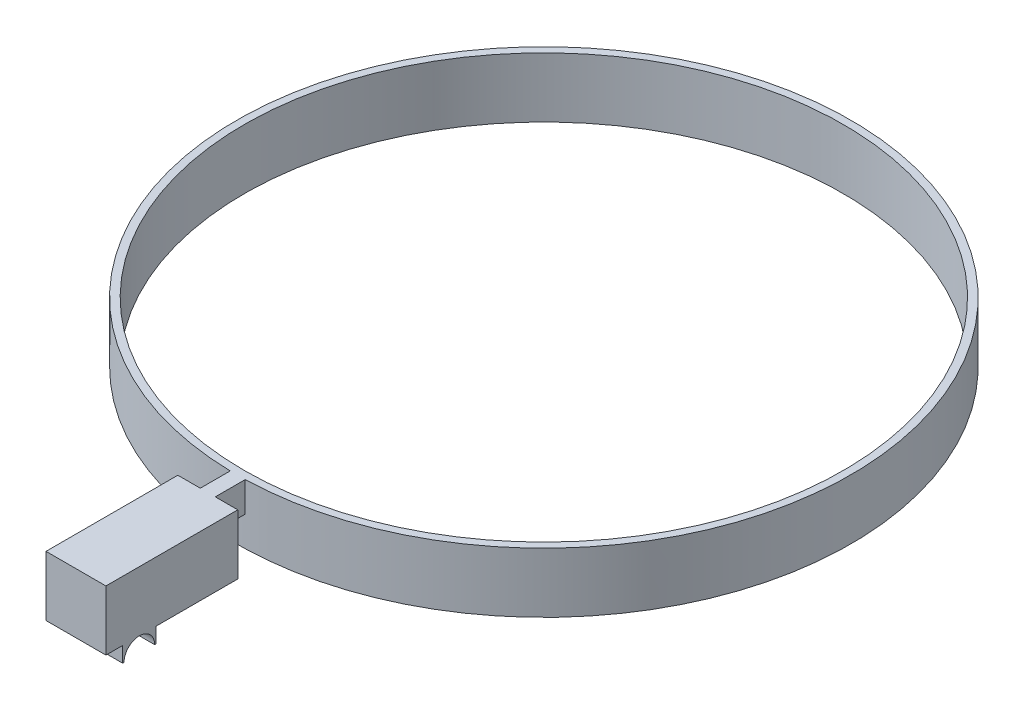
ISO-10303-21;
HEADER;
FILE_DESCRIPTION(('STEP AP214'),'2;1');
FILE_NAME('part.step','',(''),(''),'','','');
FILE_SCHEMA(('AUTOMOTIVE_DESIGN { 1 0 10303 214 1 1 1 1 }'));
ENDSEC;
DATA;
#1=APPLICATION_CONTEXT('core data for automotive mechanical design processes');
#2=APPLICATION_PROTOCOL_DEFINITION('international standard','automotive_design',2000,#1);
#3=PRODUCT_CONTEXT('',#1,'mechanical');
#4=PRODUCT('Part','Part','',(#3));
#5=PRODUCT_RELATED_PRODUCT_CATEGORY('part','',(#4));
#6=PRODUCT_DEFINITION_FORMATION('','',#4);
#7=PRODUCT_DEFINITION_CONTEXT('part definition',#1,'design');
#8=PRODUCT_DEFINITION('design','',#6,#7);
#9=PRODUCT_DEFINITION_SHAPE('','',#8);
#10=(LENGTH_UNIT() NAMED_UNIT(*) SI_UNIT(.MILLI.,.METRE.));
#11=(NAMED_UNIT(*) PLANE_ANGLE_UNIT() SI_UNIT($,.RADIAN.));
#12=(NAMED_UNIT(*) SI_UNIT($,.STERADIAN.) SOLID_ANGLE_UNIT());
#13=UNCERTAINTY_MEASURE_WITH_UNIT(LENGTH_MEASURE(1.E-05),#10,'distance_accuracy_value','');
#14=(GEOMETRIC_REPRESENTATION_CONTEXT(3) GLOBAL_UNCERTAINTY_ASSIGNED_CONTEXT((#13)) GLOBAL_UNIT_ASSIGNED_CONTEXT((#10,
#11,#12)) REPRESENTATION_CONTEXT('',''));
#15=CARTESIAN_POINT('',(0.,0.,0.));
#16=DIRECTION('',(0.,0.,1.));
#17=DIRECTION('',(1.,0.,0.));
#18=AXIS2_PLACEMENT_3D('',#15,#16,#17);
#19=CARTESIAN_POINT('',(-9.70143821147033,0.,156.461788252576));
#20=DIRECTION('',(0.,1.,0.));
#21=DIRECTION('',(0.,0.,1.));
#22=AXIS2_PLACEMENT_3D('',#19,#20,#21);
#23=PLANE('',#22);
#24=DIRECTION('',(0.,0.,-1.));
#25=VECTOR('',#24,1.);
#26=CARTESIAN_POINT('',(-9.70143821147033,0.,156.461788252576));
#27=LINE('',#26,#25);
#28=CARTESIAN_POINT('',(-9.70143821147033,0.,156.461788252576));
#29=VERTEX_POINT('',#28);
#30=CARTESIAN_POINT('',(-9.70143821147033,0.,150.911788252576));
#31=VERTEX_POINT('',#30);
#32=EDGE_CURVE('E155',#29,#31,#27,.T.);
#33=ORIENTED_EDGE('',*,*,#32,.T.);
#34=DIRECTION('',(-1.,0.,0.));
#35=VECTOR('',#34,1.);
#36=CARTESIAN_POINT('',(10.2985617885297,0.,150.911788252576));
#37=LINE('',#36,#35);
#38=CARTESIAN_POINT('',(10.2985617885297,0.,150.911788252576));
#39=VERTEX_POINT('',#38);
#40=EDGE_CURVE('E137',#39,#31,#37,.T.);
#41=ORIENTED_EDGE('',*,*,#40,.F.);
#42=DIRECTION('',(0.,0.,-1.));
#43=VECTOR('',#42,1.);
#44=CARTESIAN_POINT('',(10.2985617885297,0.,156.461788252576));
#45=LINE('',#44,#43);
#46=CARTESIAN_POINT('',(10.2985617885297,0.,156.461788252576));
#47=VERTEX_POINT('',#46);
#48=EDGE_CURVE('E168',#47,#39,#45,.T.);
#49=ORIENTED_EDGE('',*,*,#48,.F.);
#50=DIRECTION('',(1.,0.,0.));
#51=VECTOR('',#50,1.);
#52=CARTESIAN_POINT('',(-9.70143821147033,0.,156.461788252576));
#53=LINE('',#52,#51);
#54=EDGE_CURVE('E161',#29,#47,#53,.T.);
#55=ORIENTED_EDGE('',*,*,#54,.F.);
#56=EDGE_LOOP('',(#33,#41,#49,#55));
#57=FACE_BOUND('',#56,.T.);
#58=ADVANCED_FACE('F35',(#57),#23,.F.);
#59=CARTESIAN_POINT('',(0.,20.,0.));
#60=DIRECTION('',(0.,1.,0.));
#61=DIRECTION('',(0.,0.,1.));
#62=AXIS2_PLACEMENT_3D('',#59,#60,#61);
#63=PLANE('',#62);
#64=CARTESIAN_POINT('',(0.,20.,0.));
#65=DIRECTION('',(0.,1.,0.));
#66=DIRECTION('',(0.,0.,1.));
#67=AXIS2_PLACEMENT_3D('',#64,#65,#66);
#68=CIRCLE('',#67,102.5);
#69=CARTESIAN_POINT('',(2.79856178852967,20.,102.461788252576));
#70=VERTEX_POINT('',#69);
#71=CARTESIAN_POINT('',(-2.20143821147033,20.,102.476356638012));
#72=VERTEX_POINT('',#71);
#73=EDGE_CURVE('E11',#70,#72,#68,.T.);
#74=ORIENTED_EDGE('',*,*,#73,.T.);
#75=DIRECTION('',(0.,0.,1.));
#76=VECTOR('',#75,1.);
#77=CARTESIAN_POINT('',(-2.20143821147033,20.,0.));
#78=LINE('',#77,#76);
#79=CARTESIAN_POINT('',(-2.20143821147033,20.,112.461788252576));
#80=VERTEX_POINT('',#79);
#81=EDGE_CURVE('E178',#72,#80,#78,.T.);
#82=ORIENTED_EDGE('',*,*,#81,.T.);
#83=DIRECTION('',(-1.,0.,0.));
#84=VECTOR('',#83,1.);
#85=CARTESIAN_POINT('',(-9.70143821147033,20.,112.461788252576));
#86=LINE('',#85,#84);
#87=CARTESIAN_POINT('',(-9.70143821147033,20.,112.461788252576));
#88=VERTEX_POINT('',#87);
#89=EDGE_CURVE('E266',#80,#88,#86,.T.);
#90=ORIENTED_EDGE('',*,*,#89,.T.);
#91=DIRECTION('',(0.,0.,-1.));
#92=VECTOR('',#91,1.);
#93=CARTESIAN_POINT('',(-9.70143821147033,20.,156.461788252576));
#94=LINE('',#93,#92);
#95=CARTESIAN_POINT('',(-9.70143821147033,20.,156.461788252576));
#96=VERTEX_POINT('',#95);
#97=EDGE_CURVE('E162',#96,#88,#94,.T.);
#98=ORIENTED_EDGE('',*,*,#97,.F.);
#99=DIRECTION('',(-1.,0.,0.));
#100=VECTOR('',#99,1.);
#101=CARTESIAN_POINT('',(-9.70143821147033,20.,156.461788252576));
#102=LINE('',#101,#100);
#103=CARTESIAN_POINT('',(10.2985617885297,20.,156.461788252576));
#104=VERTEX_POINT('',#103);
#105=EDGE_CURVE('E276',#104,#96,#102,.T.);
#106=ORIENTED_EDGE('',*,*,#105,.F.);
#107=DIRECTION('',(0.,0.,-1.));
#108=VECTOR('',#107,1.);
#109=CARTESIAN_POINT('',(10.2985617885297,20.,156.461788252576));
#110=LINE('',#109,#108);
#111=CARTESIAN_POINT('',(10.2985617885297,20.,112.461788252576));
#112=VERTEX_POINT('',#111);
#113=EDGE_CURVE('E166',#104,#112,#110,.T.);
#114=ORIENTED_EDGE('',*,*,#113,.T.);
#115=CARTESIAN_POINT('',(2.79856178852967,20.,112.461788252576));
#116=VERTEX_POINT('',#115);
#117=EDGE_CURVE('E261',#112,#116,#86,.T.);
#118=ORIENTED_EDGE('',*,*,#117,.T.);
#119=DIRECTION('',(0.,0.,-1.));
#120=VECTOR('',#119,1.);
#121=CARTESIAN_POINT('',(2.79856178852967,20.,0.));
#122=LINE('',#121,#120);
#123=EDGE_CURVE('E57',#116,#70,#122,.T.);
#124=ORIENTED_EDGE('',*,*,#123,.T.);
#125=EDGE_LOOP('',(#74,#82,#90,#98,#106,#114,#118,#124));
#126=FACE_BOUND('',#125,.T.);
#127=CARTESIAN_POINT('',(0.,20.,0.));
#128=DIRECTION('',(0.,1.,0.));
#129=DIRECTION('',(0.,0.,1.));
#130=AXIS2_PLACEMENT_3D('',#127,#128,#129);
#131=CIRCLE('',#130,100.);
#132=CARTESIAN_POINT('',(0.,20.,100.));
#133=VERTEX_POINT('',#132);
#134=EDGE_CURVE('E200',#133,#133,#131,.T.);
#135=ORIENTED_EDGE('',*,*,#134,.F.);
#136=EDGE_LOOP('',(#135));
#137=FACE_BOUND('',#136,.T.);
#138=ADVANCED_FACE('F224',(#126,#137),#63,.T.);
#139=CARTESIAN_POINT('',(0.,0.,0.));
#140=DIRECTION('',(0.,1.,0.));
#141=DIRECTION('',(0.,0.,1.));
#142=AXIS2_PLACEMENT_3D('',#139,#140,#141);
#143=PLANE('',#142);
#144=CARTESIAN_POINT('',(0.,0.,0.));
#145=DIRECTION('',(0.,1.,0.));
#146=DIRECTION('',(0.,0.,1.));
#147=AXIS2_PLACEMENT_3D('',#144,#145,#146);
#148=CIRCLE('',#147,102.5);
#149=CARTESIAN_POINT('',(0.,0.,102.5));
#150=VERTEX_POINT('',#149);
#151=EDGE_CURVE('E39',#150,#150,#148,.T.);
#152=ORIENTED_EDGE('',*,*,#151,.F.);
#153=EDGE_LOOP('',(#152));
#154=FACE_BOUND('',#153,.T.);
#155=CARTESIAN_POINT('',(0.,0.,0.));
#156=DIRECTION('',(0.,1.,0.));
#157=DIRECTION('',(0.,0.,1.));
#158=AXIS2_PLACEMENT_3D('',#155,#156,#157);
#159=CIRCLE('',#158,100.);
#160=CARTESIAN_POINT('',(0.,0.,100.));
#161=VERTEX_POINT('',#160);
#162=EDGE_CURVE('E192',#161,#161,#159,.T.);
#163=ORIENTED_EDGE('',*,*,#162,.T.);
#164=EDGE_LOOP('',(#163));
#165=FACE_BOUND('',#164,.T.);
#166=ADVANCED_FACE('F206',(#154,#165),#143,.F.);
#167=CARTESIAN_POINT('',(0.,20.,0.));
#168=DIRECTION('',(0.,-1.,0.));
#169=DIRECTION('',(0.,0.,-1.));
#170=AXIS2_PLACEMENT_3D('',#167,#168,#169);
#171=CYLINDRICAL_SURFACE('',#170,102.5);
#172=CARTESIAN_POINT('',(0.,10.,0.));
#173=DIRECTION('',(0.,1.,0.));
#174=DIRECTION('',(0.,0.,1.));
#175=AXIS2_PLACEMENT_3D('',#172,#173,#174);
#176=CIRCLE('',#175,102.5);
#177=CARTESIAN_POINT('',(-2.20143821147033,10.,102.476356638012));
#178=VERTEX_POINT('',#177);
#179=CARTESIAN_POINT('',(2.79856178852967,10.,102.461788252576));
#180=VERTEX_POINT('',#179);
#181=EDGE_CURVE('E181',#178,#180,#176,.T.);
#182=ORIENTED_EDGE('',*,*,#181,.F.);
#183=DIRECTION('',(0.,1.,0.));
#184=VECTOR('',#183,1.);
#185=CARTESIAN_POINT('',(-2.20143821147033,10.,102.476356638012));
#186=LINE('',#185,#184);
#187=EDGE_CURVE('E193',#178,#72,#186,.T.);
#188=ORIENTED_EDGE('',*,*,#187,.T.);
#189=ORIENTED_EDGE('',*,*,#73,.F.);
#190=DIRECTION('',(0.,1.,0.));
#191=VECTOR('',#190,1.);
#192=CARTESIAN_POINT('',(2.79856178852967,10.,102.461788252576));
#193=LINE('',#192,#191);
#194=EDGE_CURVE('E196',#180,#70,#193,.T.);
#195=ORIENTED_EDGE('',*,*,#194,.F.);
#196=EDGE_LOOP('',(#182,#188,#189,#195));
#197=FACE_BOUND('',#196,.T.);
#198=ORIENTED_EDGE('',*,*,#151,.T.);
#199=EDGE_LOOP('',(#198));
#200=FACE_BOUND('',#199,.T.);
#201=ADVANCED_FACE('F37',(#197,#200),#171,.T.);
#202=CARTESIAN_POINT('',(0.,20.,0.));
#203=DIRECTION('',(0.,-1.,0.));
#204=DIRECTION('',(0.,0.,-1.));
#205=AXIS2_PLACEMENT_3D('',#202,#203,#204);
#206=CYLINDRICAL_SURFACE('',#205,100.);
#207=ORIENTED_EDGE('',*,*,#134,.T.);
#208=EDGE_LOOP('',(#207));
#209=FACE_BOUND('',#208,.T.);
#210=ORIENTED_EDGE('',*,*,#162,.F.);
#211=EDGE_LOOP('',(#210));
#212=FACE_BOUND('',#211,.T.);
#213=ADVANCED_FACE('F208',(#209,#212),#206,.F.);
#214=CARTESIAN_POINT('',(-2.20143821147033,10.,0.));
#215=DIRECTION('',(-1.,0.,0.));
#216=DIRECTION('',(0.,0.,1.));
#217=AXIS2_PLACEMENT_3D('',#214,#215,#216);
#218=PLANE('',#217);
#219=ORIENTED_EDGE('',*,*,#81,.F.);
#220=ORIENTED_EDGE('',*,*,#187,.F.);
#221=DIRECTION('',(0.,0.,1.));
#222=VECTOR('',#221,1.);
#223=CARTESIAN_POINT('',(-2.20143821147033,10.,0.));
#224=LINE('',#223,#222);
#225=CARTESIAN_POINT('',(-2.20143821147033,10.,112.461788252576));
#226=VERTEX_POINT('',#225);
#227=EDGE_CURVE('E183',#178,#226,#224,.T.);
#228=ORIENTED_EDGE('',*,*,#227,.T.);
#229=DIRECTION('',(0.,1.,0.));
#230=VECTOR('',#229,1.);
#231=CARTESIAN_POINT('',(-2.20143821147033,10.,112.461788252576));
#232=LINE('',#231,#230);
#233=EDGE_CURVE('E190',#226,#80,#232,.T.);
#234=ORIENTED_EDGE('',*,*,#233,.T.);
#235=EDGE_LOOP('',(#219,#220,#228,#234));
#236=FACE_BOUND('',#235,.T.);
#237=ADVANCED_FACE('F210',(#236),#218,.T.);
#238=CARTESIAN_POINT('',(2.79856178852967,10.,0.));
#239=DIRECTION('',(1.,0.,0.));
#240=DIRECTION('',(0.,0.,-1.));
#241=AXIS2_PLACEMENT_3D('',#238,#239,#240);
#242=PLANE('',#241);
#243=ORIENTED_EDGE('',*,*,#123,.F.);
#244=DIRECTION('',(0.,1.,0.));
#245=VECTOR('',#244,1.);
#246=CARTESIAN_POINT('',(2.79856178852967,10.,112.461788252576));
#247=LINE('',#246,#245);
#248=CARTESIAN_POINT('',(2.79856178852967,10.,112.461788252576));
#249=VERTEX_POINT('',#248);
#250=EDGE_CURVE('E186',#249,#116,#247,.T.);
#251=ORIENTED_EDGE('',*,*,#250,.F.);
#252=DIRECTION('',(0.,0.,-1.));
#253=VECTOR('',#252,1.);
#254=CARTESIAN_POINT('',(2.79856178852967,10.,0.));
#255=LINE('',#254,#253);
#256=EDGE_CURVE('E177',#249,#180,#255,.T.);
#257=ORIENTED_EDGE('',*,*,#256,.T.);
#258=ORIENTED_EDGE('',*,*,#194,.T.);
#259=EDGE_LOOP('',(#243,#251,#257,#258));
#260=FACE_BOUND('',#259,.T.);
#261=ADVANCED_FACE('F217',(#260),#242,.T.);
#262=CARTESIAN_POINT('',(0.,10.,0.));
#263=DIRECTION('',(0.,1.,0.));
#264=DIRECTION('',(0.,0.,1.));
#265=AXIS2_PLACEMENT_3D('',#262,#263,#264);
#266=PLANE('',#265);
#267=DIRECTION('',(1.,0.,0.));
#268=VECTOR('',#267,1.);
#269=CARTESIAN_POINT('',(0.,10.,112.461788252576));
#270=LINE('',#269,#268);
#271=EDGE_CURVE('E174',#226,#249,#270,.T.);
#272=ORIENTED_EDGE('',*,*,#271,.F.);
#273=ORIENTED_EDGE('',*,*,#227,.F.);
#274=ORIENTED_EDGE('',*,*,#181,.T.);
#275=ORIENTED_EDGE('',*,*,#256,.F.);
#276=EDGE_LOOP('',(#272,#273,#274,#275));
#277=FACE_BOUND('',#276,.T.);
#278=ADVANCED_FACE('F245',(#277),#266,.F.);
#279=CARTESIAN_POINT('',(10.2985617885297,20.,156.461788252576));
#280=DIRECTION('',(-1.,0.,0.));
#281=DIRECTION('',(0.,-1.,0.));
#282=AXIS2_PLACEMENT_3D('',#279,#280,#281);
#283=PLANE('',#282);
#284=DIRECTION('',(0.,1.,0.));
#285=VECTOR('',#284,1.);
#286=CARTESIAN_POINT('',(10.2985617885297,20.,112.461788252576));
#287=LINE('',#286,#285);
#288=CARTESIAN_POINT('',(10.2985617885297,0.,112.461788252576));
#289=VERTEX_POINT('',#288);
#290=EDGE_CURVE('E270',#289,#112,#287,.T.);
#291=ORIENTED_EDGE('',*,*,#290,.T.);
#292=ORIENTED_EDGE('',*,*,#113,.F.);
#293=DIRECTION('',(0.,1.,0.));
#294=VECTOR('',#293,1.);
#295=CARTESIAN_POINT('',(10.2985617885297,20.,156.461788252576));
#296=LINE('',#295,#294);
#297=EDGE_CURVE('E273',#47,#104,#296,.T.);
#298=ORIENTED_EDGE('',*,*,#297,.F.);
#299=ORIENTED_EDGE('',*,*,#48,.T.);
#300=DIRECTION('',(0.,1.,0.));
#301=VECTOR('',#300,1.);
#302=CARTESIAN_POINT('',(10.2985617885297,0.,150.911788252576));
#303=LINE('',#302,#301);
#304=CARTESIAN_POINT('',(10.2985617885297,-5.1,150.911788252576));
#305=VERTEX_POINT('',#304);
#306=EDGE_CURVE('E143',#305,#39,#303,.T.);
#307=ORIENTED_EDGE('',*,*,#306,.F.);
#308=DIRECTION('',(0.,0.,1.));
#309=VECTOR('',#308,1.);
#310=CARTESIAN_POINT('',(10.2985617885297,-5.1,0.));
#311=LINE('',#310,#309);
#312=CARTESIAN_POINT('',(10.2985617885297,-5.1,150.411788252576));
#313=VERTEX_POINT('',#312);
#314=EDGE_CURVE('E148',#313,#305,#311,.T.);
#315=ORIENTED_EDGE('',*,*,#314,.F.);
#316=CARTESIAN_POINT('',(10.2985617885297,-5.09999999999999,145.311788252576));
#317=DIRECTION('',(-1.,0.,0.));
#318=DIRECTION('',(0.,-1.,0.));
#319=AXIS2_PLACEMENT_3D('',#316,#317,#318);
#320=CIRCLE('',#319,5.09999999999999);
#321=CARTESIAN_POINT('',(10.2985617885297,-5.1,140.211788252576));
#322=VERTEX_POINT('',#321);
#323=EDGE_CURVE('E300',#313,#322,#320,.T.);
#324=ORIENTED_EDGE('',*,*,#323,.T.);
#325=DIRECTION('',(0.,0.,1.));
#326=VECTOR('',#325,1.);
#327=CARTESIAN_POINT('',(10.2985617885297,-5.1,0.));
#328=LINE('',#327,#326);
#329=CARTESIAN_POINT('',(10.2985617885297,-5.1,139.711788252576));
#330=VERTEX_POINT('',#329);
#331=EDGE_CURVE('E305',#330,#322,#328,.T.);
#332=ORIENTED_EDGE('',*,*,#331,.F.);
#333=DIRECTION('',(0.,-1.,0.));
#334=VECTOR('',#333,1.);
#335=CARTESIAN_POINT('',(10.2985617885297,0.,139.711788252576));
#336=LINE('',#335,#334);
#337=CARTESIAN_POINT('',(10.2985617885297,0.,139.711788252576));
#338=VERTEX_POINT('',#337);
#339=EDGE_CURVE('E307',#338,#330,#336,.T.);
#340=ORIENTED_EDGE('',*,*,#339,.F.);
#341=EDGE_CURVE('E50',#338,#289,#45,.T.);
#342=ORIENTED_EDGE('',*,*,#341,.T.);
#343=EDGE_LOOP('',(#291,#292,#298,#299,#307,#315,#324,#332,#340,#342));
#344=FACE_BOUND('',#343,.T.);
#345=ADVANCED_FACE('F241',(#344),#283,.F.);
#346=CARTESIAN_POINT('',(-9.70143821147033,20.,156.461788252576));
#347=DIRECTION('',(1.,0.,0.));
#348=DIRECTION('',(0.,1.,0.));
#349=AXIS2_PLACEMENT_3D('',#346,#347,#348);
#350=PLANE('',#349);
#351=DIRECTION('',(0.,-1.,0.));
#352=VECTOR('',#351,1.);
#353=CARTESIAN_POINT('',(-9.70143821147033,20.,112.461788252576));
#354=LINE('',#353,#352);
#355=CARTESIAN_POINT('',(-9.70143821147033,0.,112.461788252576));
#356=VERTEX_POINT('',#355);
#357=EDGE_CURVE('E265',#88,#356,#354,.T.);
#358=ORIENTED_EDGE('',*,*,#357,.T.);
#359=CARTESIAN_POINT('',(-9.70143821147033,0.,139.711788252576));
#360=VERTEX_POINT('',#359);
#361=EDGE_CURVE('E163',#360,#356,#27,.T.);
#362=ORIENTED_EDGE('',*,*,#361,.F.);
#363=DIRECTION('',(0.,-1.,0.));
#364=VECTOR('',#363,1.);
#365=CARTESIAN_POINT('',(-9.70143821147033,0.,139.711788252576));
#366=LINE('',#365,#364);
#367=CARTESIAN_POINT('',(-9.70143821147033,-5.1,139.711788252576));
#368=VERTEX_POINT('',#367);
#369=EDGE_CURVE('E301',#360,#368,#366,.T.);
#370=ORIENTED_EDGE('',*,*,#369,.T.);
#371=DIRECTION('',(0.,0.,1.));
#372=VECTOR('',#371,1.);
#373=CARTESIAN_POINT('',(-9.70143821147033,-5.1,0.));
#374=LINE('',#373,#372);
#375=CARTESIAN_POINT('',(-9.70143821147033,-5.1,140.211788252576));
#376=VERTEX_POINT('',#375);
#377=EDGE_CURVE('E297',#368,#376,#374,.T.);
#378=ORIENTED_EDGE('',*,*,#377,.T.);
#379=CARTESIAN_POINT('',(-9.70143821147033,-5.09999999999999,145.311788252576));
#380=DIRECTION('',(-1.,0.,0.));
#381=DIRECTION('',(0.,-1.,0.));
#382=AXIS2_PLACEMENT_3D('',#379,#380,#381);
#383=CIRCLE('',#382,5.09999999999999);
#384=CARTESIAN_POINT('',(-9.70143821147033,-5.1,150.411788252576));
#385=VERTEX_POINT('',#384);
#386=EDGE_CURVE('E159',#385,#376,#383,.T.);
#387=ORIENTED_EDGE('',*,*,#386,.F.);
#388=DIRECTION('',(0.,0.,1.));
#389=VECTOR('',#388,1.);
#390=CARTESIAN_POINT('',(-9.70143821147033,-5.1,0.));
#391=LINE('',#390,#389);
#392=CARTESIAN_POINT('',(-9.70143821147033,-5.1,150.911788252576));
#393=VERTEX_POINT('',#392);
#394=EDGE_CURVE('E158',#385,#393,#391,.T.);
#395=ORIENTED_EDGE('',*,*,#394,.T.);
#396=DIRECTION('',(0.,1.,0.));
#397=VECTOR('',#396,1.);
#398=CARTESIAN_POINT('',(-9.70143821147033,0.,150.911788252576));
#399=LINE('',#398,#397);
#400=EDGE_CURVE('E140',#393,#31,#399,.T.);
#401=ORIENTED_EDGE('',*,*,#400,.T.);
#402=ORIENTED_EDGE('',*,*,#32,.F.);
#403=DIRECTION('',(0.,-1.,0.));
#404=VECTOR('',#403,1.);
#405=CARTESIAN_POINT('',(-9.70143821147033,20.,156.461788252576));
#406=LINE('',#405,#404);
#407=EDGE_CURVE('E279',#96,#29,#406,.T.);
#408=ORIENTED_EDGE('',*,*,#407,.F.);
#409=ORIENTED_EDGE('',*,*,#97,.T.);
#410=EDGE_LOOP('',(#358,#362,#370,#378,#387,#395,#401,#402,#408,#409));
#411=FACE_BOUND('',#410,.T.);
#412=ADVANCED_FACE('F153',(#411),#350,.F.);
#413=ORIENTED_EDGE('',*,*,#341,.F.);
#414=DIRECTION('',(-1.,0.,0.));
#415=VECTOR('',#414,1.);
#416=CARTESIAN_POINT('',(10.2985617885297,0.,139.711788252576));
#417=LINE('',#416,#415);
#418=EDGE_CURVE('E282',#338,#360,#417,.T.);
#419=ORIENTED_EDGE('',*,*,#418,.T.);
#420=ORIENTED_EDGE('',*,*,#361,.T.);
#421=DIRECTION('',(1.,0.,0.));
#422=VECTOR('',#421,1.);
#423=CARTESIAN_POINT('',(-9.70143821147033,0.,112.461788252576));
#424=LINE('',#423,#422);
#425=EDGE_CURVE('E268',#356,#289,#424,.T.);
#426=ORIENTED_EDGE('',*,*,#425,.T.);
#427=EDGE_LOOP('',(#413,#419,#420,#426));
#428=FACE_BOUND('',#427,.T.);
#429=ADVANCED_FACE('F226',(#428),#23,.F.);
#430=CARTESIAN_POINT('',(0.,0.,156.461788252576));
#431=DIRECTION('',(0.,0.,1.));
#432=DIRECTION('',(1.,0.,0.));
#433=AXIS2_PLACEMENT_3D('',#430,#431,#432);
#434=PLANE('',#433);
#435=ORIENTED_EDGE('',*,*,#297,.T.);
#436=ORIENTED_EDGE('',*,*,#105,.T.);
#437=ORIENTED_EDGE('',*,*,#407,.T.);
#438=ORIENTED_EDGE('',*,*,#54,.T.);
#439=EDGE_LOOP('',(#435,#436,#437,#438));
#440=FACE_BOUND('',#439,.T.);
#441=ADVANCED_FACE('F233',(#440),#434,.T.);
#442=CARTESIAN_POINT('',(0.,0.,112.461788252576));
#443=DIRECTION('',(0.,0.,1.));
#444=DIRECTION('',(1.,0.,0.));
#445=AXIS2_PLACEMENT_3D('',#442,#443,#444);
#446=PLANE('',#445);
#447=ORIENTED_EDGE('',*,*,#233,.F.);
#448=ORIENTED_EDGE('',*,*,#271,.T.);
#449=ORIENTED_EDGE('',*,*,#250,.T.);
#450=ORIENTED_EDGE('',*,*,#117,.F.);
#451=ORIENTED_EDGE('',*,*,#290,.F.);
#452=ORIENTED_EDGE('',*,*,#425,.F.);
#453=ORIENTED_EDGE('',*,*,#357,.F.);
#454=ORIENTED_EDGE('',*,*,#89,.F.);
#455=EDGE_LOOP('',(#447,#448,#449,#450,#451,#452,#453,#454));
#456=FACE_BOUND('',#455,.T.);
#457=ADVANCED_FACE('F238',(#456),#446,.F.);
#458=CARTESIAN_POINT('',(10.2985617885297,-5.09999999999999,145.311788252576));
#459=DIRECTION('',(-1.,0.,0.));
#460=DIRECTION('',(0.,-1.,0.));
#461=AXIS2_PLACEMENT_3D('',#458,#459,#460);
#462=CYLINDRICAL_SURFACE('',#461,5.09999999999999);
#463=ORIENTED_EDGE('',*,*,#386,.T.);
#464=DIRECTION('',(-1.,0.,0.));
#465=VECTOR('',#464,1.);
#466=CARTESIAN_POINT('',(10.2985617885297,-5.1,140.211788252576));
#467=LINE('',#466,#465);
#468=EDGE_CURVE('E288',#322,#376,#467,.T.);
#469=ORIENTED_EDGE('',*,*,#468,.F.);
#470=ORIENTED_EDGE('',*,*,#323,.F.);
#471=DIRECTION('',(-1.,0.,0.));
#472=VECTOR('',#471,1.);
#473=CARTESIAN_POINT('',(10.2985617885297,-5.1,150.411788252576));
#474=LINE('',#473,#472);
#475=EDGE_CURVE('E314',#313,#385,#474,.T.);
#476=ORIENTED_EDGE('',*,*,#475,.T.);
#477=EDGE_LOOP('',(#463,#469,#470,#476));
#478=FACE_BOUND('',#477,.T.);
#479=ADVANCED_FACE('F320',(#478),#462,.F.);
#480=CARTESIAN_POINT('',(10.2985617885297,-5.1,0.));
#481=DIRECTION('',(0.,-1.,0.));
#482=DIRECTION('',(1.,0.,0.));
#483=AXIS2_PLACEMENT_3D('',#480,#481,#482);
#484=PLANE('',#483);
#485=ORIENTED_EDGE('',*,*,#377,.F.);
#486=DIRECTION('',(-1.,0.,0.));
#487=VECTOR('',#486,1.);
#488=CARTESIAN_POINT('',(10.2985617885297,-5.1,139.711788252576));
#489=LINE('',#488,#487);
#490=EDGE_CURVE('E289',#330,#368,#489,.T.);
#491=ORIENTED_EDGE('',*,*,#490,.F.);
#492=ORIENTED_EDGE('',*,*,#331,.T.);
#493=ORIENTED_EDGE('',*,*,#468,.T.);
#494=EDGE_LOOP('',(#485,#491,#492,#493));
#495=FACE_BOUND('',#494,.T.);
#496=ADVANCED_FACE('F324',(#495),#484,.T.);
#497=CARTESIAN_POINT('',(10.2985617885297,0.,139.711788252576));
#498=DIRECTION('',(0.,0.,-1.));
#499=DIRECTION('',(-1.,0.,0.));
#500=AXIS2_PLACEMENT_3D('',#497,#498,#499);
#501=PLANE('',#500);
#502=ORIENTED_EDGE('',*,*,#369,.F.);
#503=ORIENTED_EDGE('',*,*,#418,.F.);
#504=ORIENTED_EDGE('',*,*,#339,.T.);
#505=ORIENTED_EDGE('',*,*,#490,.T.);
#506=EDGE_LOOP('',(#502,#503,#504,#505));
#507=FACE_BOUND('',#506,.T.);
#508=ADVANCED_FACE('F327',(#507),#501,.T.);
#509=CARTESIAN_POINT('',(10.2985617885297,0.,150.911788252576));
#510=DIRECTION('',(0.,0.,1.));
#511=DIRECTION('',(1.,0.,0.));
#512=AXIS2_PLACEMENT_3D('',#509,#510,#511);
#513=PLANE('',#512);
#514=ORIENTED_EDGE('',*,*,#400,.F.);
#515=DIRECTION('',(-1.,0.,0.));
#516=VECTOR('',#515,1.);
#517=CARTESIAN_POINT('',(10.2985617885297,-5.1,150.911788252576));
#518=LINE('',#517,#516);
#519=EDGE_CURVE('E312',#305,#393,#518,.T.);
#520=ORIENTED_EDGE('',*,*,#519,.F.);
#521=ORIENTED_EDGE('',*,*,#306,.T.);
#522=ORIENTED_EDGE('',*,*,#40,.T.);
#523=EDGE_LOOP('',(#514,#520,#521,#522));
#524=FACE_BOUND('',#523,.T.);
#525=ADVANCED_FACE('F139',(#524),#513,.T.);
#526=CARTESIAN_POINT('',(10.2985617885297,-5.1,0.));
#527=DIRECTION('',(0.,-1.,0.));
#528=DIRECTION('',(1.,0.,0.));
#529=AXIS2_PLACEMENT_3D('',#526,#527,#528);
#530=PLANE('',#529);
#531=ORIENTED_EDGE('',*,*,#394,.F.);
#532=ORIENTED_EDGE('',*,*,#475,.F.);
#533=ORIENTED_EDGE('',*,*,#314,.T.);
#534=ORIENTED_EDGE('',*,*,#519,.T.);
#535=EDGE_LOOP('',(#531,#532,#533,#534));
#536=FACE_BOUND('',#535,.T.);
#537=ADVANCED_FACE('F322',(#536),#530,.T.);
#538=CLOSED_SHELL('',(#58,#138,#166,#201,#213,#237,#261,#278,#345,#412,#429,#441,#457,#479,#496,
#508,#525,#537));
#539=MANIFOLD_SOLID_BREP('B2',#538);
#540=ADVANCED_BREP_SHAPE_REPRESENTATION('',(#18,#539),#14);
#541=SHAPE_DEFINITION_REPRESENTATION(#9,#540);
ENDSEC;
END-ISO-10303-21;
